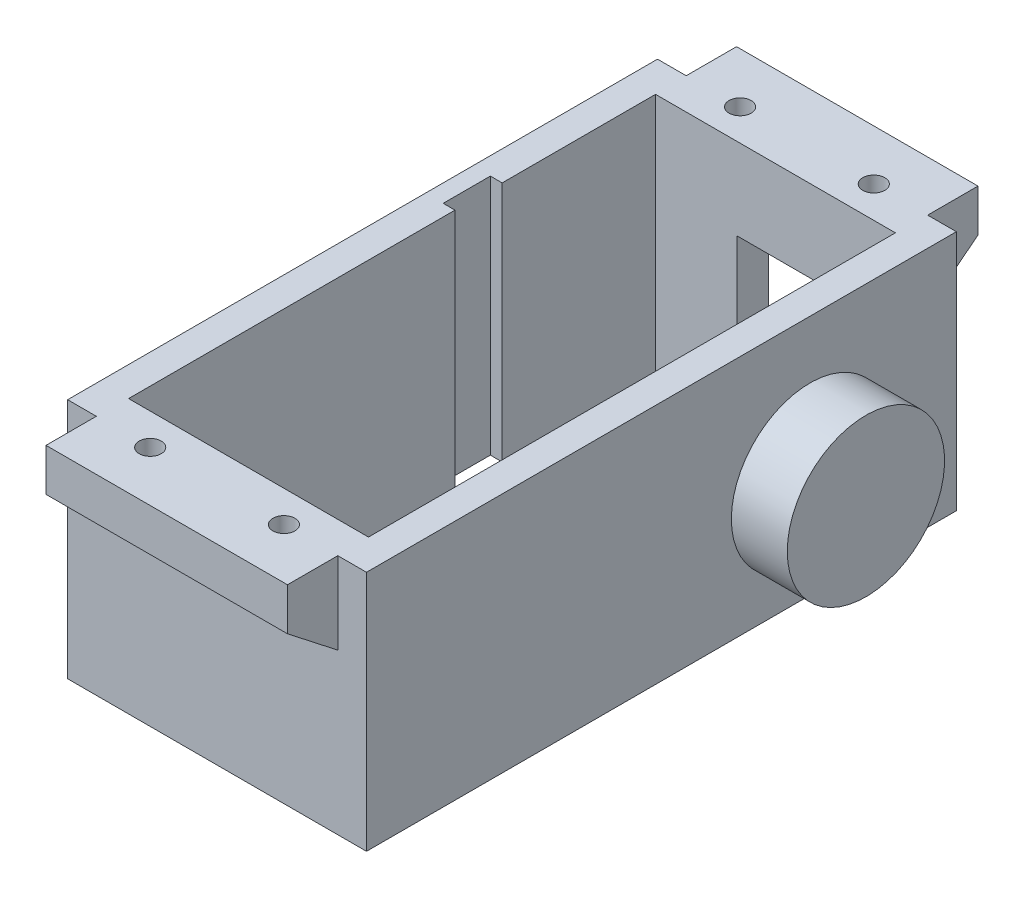
ISO-10303-21;
HEADER;
FILE_DESCRIPTION(('STEP AP214'),'2;1');
FILE_NAME('part.step','',(''),(''),'','','');
FILE_SCHEMA(('AUTOMOTIVE_DESIGN { 1 0 10303 214 1 1 1 1 }'));
ENDSEC;
DATA;
#1=APPLICATION_CONTEXT('core data for automotive mechanical design processes');
#2=APPLICATION_PROTOCOL_DEFINITION('international standard','automotive_design',2000,#1);
#3=PRODUCT_CONTEXT('',#1,'mechanical');
#4=PRODUCT('Part','Part','',(#3));
#5=PRODUCT_RELATED_PRODUCT_CATEGORY('part','',(#4));
#6=PRODUCT_DEFINITION_FORMATION('','',#4);
#7=PRODUCT_DEFINITION_CONTEXT('part definition',#1,'design');
#8=PRODUCT_DEFINITION('design','',#6,#7);
#9=PRODUCT_DEFINITION_SHAPE('','',#8);
#10=(LENGTH_UNIT() NAMED_UNIT(*) SI_UNIT(.MILLI.,.METRE.));
#11=(NAMED_UNIT(*) PLANE_ANGLE_UNIT() SI_UNIT($,.RADIAN.));
#12=(NAMED_UNIT(*) SI_UNIT($,.STERADIAN.) SOLID_ANGLE_UNIT());
#13=UNCERTAINTY_MEASURE_WITH_UNIT(LENGTH_MEASURE(1.E-05),#10,'distance_accuracy_value','');
#14=(GEOMETRIC_REPRESENTATION_CONTEXT(3) GLOBAL_UNCERTAINTY_ASSIGNED_CONTEXT((#13)) GLOBAL_UNIT_ASSIGNED_CONTEXT((#10,
#11,#12)) REPRESENTATION_CONTEXT('',''));
#15=CARTESIAN_POINT('',(0.,0.,0.));
#16=DIRECTION('',(0.,0.,1.));
#17=DIRECTION('',(1.,0.,0.));
#18=AXIS2_PLACEMENT_3D('',#15,#16,#17);
#19=CARTESIAN_POINT('',(-15.25,0.,33.5));
#20=DIRECTION('',(-1.,0.,0.));
#21=DIRECTION('',(0.,0.,1.));
#22=AXIS2_PLACEMENT_3D('',#19,#20,#21);
#23=PLANE('',#22);
#24=DIRECTION('',(0.,0.,1.));
#25=VECTOR('',#24,1.);
#26=CARTESIAN_POINT('',(-15.25,0.,33.5));
#27=LINE('',#26,#25);
#28=CARTESIAN_POINT('',(-15.25,0.,-8.00000000000001));
#29=VERTEX_POINT('',#28);
#30=CARTESIAN_POINT('',(-15.25,0.,33.5));
#31=VERTEX_POINT('',#30);
#32=EDGE_CURVE('E331',#29,#31,#27,.T.);
#33=ORIENTED_EDGE('',*,*,#32,.F.);
#34=DIRECTION('',(0.,-1.,0.));
#35=VECTOR('',#34,1.);
#36=CARTESIAN_POINT('',(-15.25,0.,-8.00000000000001));
#37=LINE('',#36,#35);
#38=CARTESIAN_POINT('',(-15.25,30.73,-8.00000000000001));
#39=VERTEX_POINT('',#38);
#40=EDGE_CURVE('E209',#39,#29,#37,.T.);
#41=ORIENTED_EDGE('',*,*,#40,.F.);
#42=DIRECTION('',(0.,0.,1.));
#43=VECTOR('',#42,1.);
#44=CARTESIAN_POINT('',(-15.25,30.73,33.5));
#45=LINE('',#44,#43);
#46=CARTESIAN_POINT('',(-15.25,30.73,33.5));
#47=VERTEX_POINT('',#46);
#48=EDGE_CURVE('E325',#39,#47,#45,.T.);
#49=ORIENTED_EDGE('',*,*,#48,.T.);
#50=DIRECTION('',(0.,1.,0.));
#51=VECTOR('',#50,1.);
#52=CARTESIAN_POINT('',(-15.25,0.,33.5));
#53=LINE('',#52,#51);
#54=EDGE_CURVE('E341',#31,#47,#53,.T.);
#55=ORIENTED_EDGE('',*,*,#54,.F.);
#56=EDGE_LOOP('',(#33,#41,#49,#55));
#57=FACE_BOUND('',#56,.T.);
#58=ADVANCED_FACE('F43',(#57),#23,.F.);
#59=CARTESIAN_POINT('',(15.35,20.33,43.9));
#60=DIRECTION('',(1.,0.,0.));
#61=DIRECTION('',(0.,0.,-1.));
#62=AXIS2_PLACEMENT_3D('',#59,#60,#61);
#63=PLANE('',#62);
#64=DIRECTION('',(0.,-1.,0.));
#65=VECTOR('',#64,1.);
#66=CARTESIAN_POINT('',(15.35,20.33,43.9));
#67=LINE('',#66,#65);
#68=CARTESIAN_POINT('',(15.35,30.73,43.9));
#69=VERTEX_POINT('',#68);
#70=CARTESIAN_POINT('',(15.35,25.330228009643,43.9));
#71=VERTEX_POINT('',#70);
#72=EDGE_CURVE('E269',#69,#71,#67,.T.);
#73=ORIENTED_EDGE('',*,*,#72,.T.);
#74=DIRECTION('',(0.,-0.615661475325662,-0.788010753606719));
#75=VECTOR('',#74,1.);
#76=CARTESIAN_POINT('',(15.35,20.33,37.5));
#77=LINE('',#76,#75);
#78=CARTESIAN_POINT('',(15.35,20.33,37.5));
#79=VERTEX_POINT('',#78);
#80=EDGE_CURVE('E66',#71,#79,#77,.T.);
#81=ORIENTED_EDGE('',*,*,#80,.T.);
#82=DIRECTION('',(0.,-1.,0.));
#83=VECTOR('',#82,1.);
#84=CARTESIAN_POINT('',(15.35,20.33,37.5));
#85=LINE('',#84,#83);
#86=CARTESIAN_POINT('',(15.35,30.73,37.5));
#87=VERTEX_POINT('',#86);
#88=EDGE_CURVE('E268',#87,#79,#85,.T.);
#89=ORIENTED_EDGE('',*,*,#88,.F.);
#90=DIRECTION('',(0.,0.,-1.));
#91=VECTOR('',#90,1.);
#92=CARTESIAN_POINT('',(15.35,30.73,43.9));
#93=LINE('',#92,#91);
#94=EDGE_CURVE('E287',#69,#87,#93,.T.);
#95=ORIENTED_EDGE('',*,*,#94,.F.);
#96=EDGE_LOOP('',(#73,#81,#89,#95));
#97=FACE_BOUND('',#96,.T.);
#98=ADVANCED_FACE('F472',(#97),#63,.T.);
#99=CARTESIAN_POINT('',(-15.35,20.33,43.9));
#100=DIRECTION('',(-1.,0.,0.));
#101=DIRECTION('',(0.,0.,1.));
#102=AXIS2_PLACEMENT_3D('',#99,#100,#101);
#103=PLANE('',#102);
#104=DIRECTION('',(0.,1.,0.));
#105=VECTOR('',#104,1.);
#106=CARTESIAN_POINT('',(-15.35,20.33,37.5));
#107=LINE('',#106,#105);
#108=CARTESIAN_POINT('',(-15.35,20.33,37.5));
#109=VERTEX_POINT('',#108);
#110=CARTESIAN_POINT('',(-15.35,30.73,37.5));
#111=VERTEX_POINT('',#110);
#112=EDGE_CURVE('E281',#109,#111,#107,.T.);
#113=ORIENTED_EDGE('',*,*,#112,.F.);
#114=DIRECTION('',(0.,-0.615661475325662,-0.788010753606719));
#115=VECTOR('',#114,1.);
#116=CARTESIAN_POINT('',(-15.35,20.33,37.5));
#117=LINE('',#116,#115);
#118=CARTESIAN_POINT('',(-15.35,25.330228009643,43.9));
#119=VERTEX_POINT('',#118);
#120=EDGE_CURVE('E266',#119,#109,#117,.T.);
#121=ORIENTED_EDGE('',*,*,#120,.F.);
#122=DIRECTION('',(0.,1.,0.));
#123=VECTOR('',#122,1.);
#124=CARTESIAN_POINT('',(-15.35,20.33,43.9));
#125=LINE('',#124,#123);
#126=CARTESIAN_POINT('',(-15.35,30.73,43.9));
#127=VERTEX_POINT('',#126);
#128=EDGE_CURVE('E276',#119,#127,#125,.T.);
#129=ORIENTED_EDGE('',*,*,#128,.T.);
#130=DIRECTION('',(0.,0.,-1.));
#131=VECTOR('',#130,1.);
#132=CARTESIAN_POINT('',(-15.35,30.73,43.9));
#133=LINE('',#132,#131);
#134=EDGE_CURVE('E278',#127,#111,#133,.T.);
#135=ORIENTED_EDGE('',*,*,#134,.T.);
#136=EDGE_LOOP('',(#113,#121,#129,#135));
#137=FACE_BOUND('',#136,.T.);
#138=ADVANCED_FACE('F476',(#137),#103,.T.);
#139=CARTESIAN_POINT('',(0.,0.,43.9));
#140=DIRECTION('',(0.,0.,1.));
#141=DIRECTION('',(-1.,0.,0.));
#142=AXIS2_PLACEMENT_3D('',#139,#140,#141);
#143=PLANE('',#142);
#144=ORIENTED_EDGE('',*,*,#128,.F.);
#145=DIRECTION('',(1.,0.,0.));
#146=VECTOR('',#145,1.);
#147=CARTESIAN_POINT('',(-26.111,25.330228009643,43.9));
#148=LINE('',#147,#146);
#149=EDGE_CURVE('E264',#119,#71,#148,.T.);
#150=ORIENTED_EDGE('',*,*,#149,.T.);
#151=ORIENTED_EDGE('',*,*,#72,.F.);
#152=DIRECTION('',(1.,0.,0.));
#153=VECTOR('',#152,1.);
#154=CARTESIAN_POINT('',(-15.35,30.73,43.9));
#155=LINE('',#154,#153);
#156=EDGE_CURVE('E272',#127,#69,#155,.T.);
#157=ORIENTED_EDGE('',*,*,#156,.F.);
#158=EDGE_LOOP('',(#144,#150,#151,#157));
#159=FACE_BOUND('',#158,.T.);
#160=ADVANCED_FACE('F470',(#159),#143,.T.);
#161=CARTESIAN_POINT('',(19.,30.73,-37.5));
#162=DIRECTION('',(0.,0.,1.));
#163=DIRECTION('',(1.,0.,0.));
#164=AXIS2_PLACEMENT_3D('',#161,#162,#163);
#165=PLANE('',#164);
#166=DIRECTION('',(-1.,0.,0.));
#167=VECTOR('',#166,1.);
#168=CARTESIAN_POINT('',(19.,0.,-37.5));
#169=LINE('',#168,#167);
#170=CARTESIAN_POINT('',(19.,0.,-37.5));
#171=VERTEX_POINT('',#170);
#172=CARTESIAN_POINT('',(4.9,0.,-37.5));
#173=VERTEX_POINT('',#172);
#174=EDGE_CURVE('E392',#171,#173,#169,.T.);
#175=ORIENTED_EDGE('',*,*,#174,.T.);
#176=DIRECTION('',(0.,-1.,0.));
#177=VECTOR('',#176,1.);
#178=CARTESIAN_POINT('',(4.9,0.,-37.5));
#179=LINE('',#178,#177);
#180=CARTESIAN_POINT('',(4.9,20.33,-37.5));
#181=VERTEX_POINT('',#180);
#182=EDGE_CURVE('E305',#181,#173,#179,.T.);
#183=ORIENTED_EDGE('',*,*,#182,.F.);
#184=DIRECTION('',(-1.,0.,0.));
#185=VECTOR('',#184,1.);
#186=CARTESIAN_POINT('',(-15.35,20.33,-37.5));
#187=LINE('',#186,#185);
#188=CARTESIAN_POINT('',(15.35,20.33,-37.5));
#189=VERTEX_POINT('',#188);
#190=EDGE_CURVE('E375',#189,#181,#187,.T.);
#191=ORIENTED_EDGE('',*,*,#190,.F.);
#192=DIRECTION('',(0.,-1.,0.));
#193=VECTOR('',#192,1.);
#194=CARTESIAN_POINT('',(15.35,20.33,-37.5));
#195=LINE('',#194,#193);
#196=CARTESIAN_POINT('',(15.35,30.73,-37.5));
#197=VERTEX_POINT('',#196);
#198=EDGE_CURVE('E356',#197,#189,#195,.T.);
#199=ORIENTED_EDGE('',*,*,#198,.F.);
#200=DIRECTION('',(-1.,0.,0.));
#201=VECTOR('',#200,1.);
#202=CARTESIAN_POINT('',(19.,30.73,-37.5));
#203=LINE('',#202,#201);
#204=CARTESIAN_POINT('',(19.,30.73,-37.5));
#205=VERTEX_POINT('',#204);
#206=EDGE_CURVE('E399',#205,#197,#203,.T.);
#207=ORIENTED_EDGE('',*,*,#206,.F.);
#208=DIRECTION('',(0.,-1.,0.));
#209=VECTOR('',#208,1.);
#210=CARTESIAN_POINT('',(19.,30.73,-37.5));
#211=LINE('',#210,#209);
#212=EDGE_CURVE('E414',#205,#171,#211,.T.);
#213=ORIENTED_EDGE('',*,*,#212,.T.);
#214=EDGE_LOOP('',(#175,#183,#191,#199,#207,#213));
#215=FACE_BOUND('',#214,.T.);
#216=ADVANCED_FACE('F439',(#215),#165,.F.);
#217=CARTESIAN_POINT('',(-4.9,20.33,-37.5));
#218=VERTEX_POINT('',#217);
#219=CARTESIAN_POINT('',(-15.35,20.33,-37.5));
#220=VERTEX_POINT('',#219);
#221=EDGE_CURVE('E374',#218,#220,#187,.T.);
#222=ORIENTED_EDGE('',*,*,#221,.F.);
#223=DIRECTION('',(0.,1.,0.));
#224=VECTOR('',#223,1.);
#225=CARTESIAN_POINT('',(-4.9,0.,-37.5));
#226=LINE('',#225,#224);
#227=CARTESIAN_POINT('',(-4.9,0.,-37.5));
#228=VERTEX_POINT('',#227);
#229=EDGE_CURVE('E307',#228,#218,#226,.T.);
#230=ORIENTED_EDGE('',*,*,#229,.F.);
#231=CARTESIAN_POINT('',(-19.,0.,-37.5));
#232=VERTEX_POINT('',#231);
#233=EDGE_CURVE('E409',#228,#232,#169,.T.);
#234=ORIENTED_EDGE('',*,*,#233,.T.);
#235=DIRECTION('',(0.,-1.,0.));
#236=VECTOR('',#235,1.);
#237=CARTESIAN_POINT('',(-19.,30.73,-37.5));
#238=LINE('',#237,#236);
#239=CARTESIAN_POINT('',(-19.,30.73,-37.5));
#240=VERTEX_POINT('',#239);
#241=EDGE_CURVE('E402',#240,#232,#238,.T.);
#242=ORIENTED_EDGE('',*,*,#241,.F.);
#243=CARTESIAN_POINT('',(-15.35,30.73,-37.5));
#244=VERTEX_POINT('',#243);
#245=EDGE_CURVE('E398',#244,#240,#203,.T.);
#246=ORIENTED_EDGE('',*,*,#245,.F.);
#247=DIRECTION('',(0.,1.,0.));
#248=VECTOR('',#247,1.);
#249=CARTESIAN_POINT('',(-15.35,20.33,-37.5));
#250=LINE('',#249,#248);
#251=EDGE_CURVE('E367',#220,#244,#250,.T.);
#252=ORIENTED_EDGE('',*,*,#251,.F.);
#253=EDGE_LOOP('',(#222,#230,#234,#242,#246,#252));
#254=FACE_BOUND('',#253,.T.);
#255=ADVANCED_FACE('F461',(#254),#165,.F.);
#256=CARTESIAN_POINT('',(-19.,30.73,37.5));
#257=DIRECTION('',(1.,0.,0.));
#258=DIRECTION('',(0.,0.,-1.));
#259=AXIS2_PLACEMENT_3D('',#256,#257,#258);
#260=PLANE('',#259);
#261=CARTESIAN_POINT('',(-19.,13.38,-18.89));
#262=DIRECTION('',(1.,0.,0.));
#263=DIRECTION('',(0.,0.,-1.));
#264=AXIS2_PLACEMENT_3D('',#261,#262,#263);
#265=CIRCLE('',#264,10.);
#266=CARTESIAN_POINT('',(-19.,13.38,-28.89));
#267=VERTEX_POINT('',#266);
#268=EDGE_CURVE('E11',#267,#267,#265,.F.);
#269=ORIENTED_EDGE('',*,*,#268,.F.);
#270=EDGE_LOOP('',(#269));
#271=FACE_BOUND('',#270,.T.);
#272=DIRECTION('',(0.,0.,1.));
#273=VECTOR('',#272,1.);
#274=CARTESIAN_POINT('',(-19.,0.,37.5));
#275=LINE('',#274,#273);
#276=CARTESIAN_POINT('',(-19.,0.,37.5));
#277=VERTEX_POINT('',#276);
#278=EDGE_CURVE('E387',#232,#277,#275,.T.);
#279=ORIENTED_EDGE('',*,*,#278,.T.);
#280=DIRECTION('',(0.,-1.,0.));
#281=VECTOR('',#280,1.);
#282=CARTESIAN_POINT('',(-19.,30.73,37.5));
#283=LINE('',#282,#281);
#284=CARTESIAN_POINT('',(-19.,30.73,37.5));
#285=VERTEX_POINT('',#284);
#286=EDGE_CURVE('E51',#285,#277,#283,.T.);
#287=ORIENTED_EDGE('',*,*,#286,.F.);
#288=DIRECTION('',(0.,0.,1.));
#289=VECTOR('',#288,1.);
#290=CARTESIAN_POINT('',(-19.,30.73,37.5));
#291=LINE('',#290,#289);
#292=EDGE_CURVE('E388',#240,#285,#291,.T.);
#293=ORIENTED_EDGE('',*,*,#292,.F.);
#294=ORIENTED_EDGE('',*,*,#241,.T.);
#295=EDGE_LOOP('',(#279,#287,#293,#294));
#296=FACE_BOUND('',#295,.T.);
#297=ADVANCED_FACE('F45',(#271,#296),#260,.F.);
#298=CARTESIAN_POINT('',(19.,30.73,37.5));
#299=DIRECTION('',(0.,0.,-1.));
#300=DIRECTION('',(-1.,0.,0.));
#301=AXIS2_PLACEMENT_3D('',#298,#299,#300);
#302=PLANE('',#301);
#303=DIRECTION('',(1.,0.,0.));
#304=VECTOR('',#303,1.);
#305=CARTESIAN_POINT('',(19.,30.73,37.5));
#306=LINE('',#305,#304);
#307=CARTESIAN_POINT('',(19.,30.73,37.5));
#308=VERTEX_POINT('',#307);
#309=EDGE_CURVE('E391',#87,#308,#306,.T.);
#310=ORIENTED_EDGE('',*,*,#309,.F.);
#311=ORIENTED_EDGE('',*,*,#88,.T.);
#312=DIRECTION('',(-1.,0.,0.));
#313=VECTOR('',#312,1.);
#314=CARTESIAN_POINT('',(-15.35,20.33,37.5));
#315=LINE('',#314,#313);
#316=EDGE_CURVE('E273',#79,#109,#315,.T.);
#317=ORIENTED_EDGE('',*,*,#316,.T.);
#318=ORIENTED_EDGE('',*,*,#112,.T.);
#319=EDGE_CURVE('E393',#285,#111,#306,.T.);
#320=ORIENTED_EDGE('',*,*,#319,.F.);
#321=ORIENTED_EDGE('',*,*,#286,.T.);
#322=DIRECTION('',(1.,0.,0.));
#323=VECTOR('',#322,1.);
#324=CARTESIAN_POINT('',(19.,0.,37.5));
#325=LINE('',#324,#323);
#326=CARTESIAN_POINT('',(19.,0.,37.5));
#327=VERTEX_POINT('',#326);
#328=EDGE_CURVE('E405',#277,#327,#325,.T.);
#329=ORIENTED_EDGE('',*,*,#328,.T.);
#330=DIRECTION('',(0.,-1.,0.));
#331=VECTOR('',#330,1.);
#332=CARTESIAN_POINT('',(19.,30.73,37.5));
#333=LINE('',#332,#331);
#334=EDGE_CURVE('E417',#308,#327,#333,.T.);
#335=ORIENTED_EDGE('',*,*,#334,.F.);
#336=EDGE_LOOP('',(#310,#311,#317,#318,#320,#321,#329,#335));
#337=FACE_BOUND('',#336,.T.);
#338=ADVANCED_FACE('F423',(#337),#302,.F.);
#339=CARTESIAN_POINT('',(19.,30.73,37.5));
#340=DIRECTION('',(-1.,0.,0.));
#341=DIRECTION('',(0.,0.,1.));
#342=AXIS2_PLACEMENT_3D('',#339,#340,#341);
#343=PLANE('',#342);
#344=CARTESIAN_POINT('',(19.,13.38,-18.89));
#345=DIRECTION('',(-1.,0.,0.));
#346=DIRECTION('',(0.,0.,1.));
#347=AXIS2_PLACEMENT_3D('',#344,#345,#346);
#348=CIRCLE('',#347,10.);
#349=CARTESIAN_POINT('',(19.,13.38,-8.89));
#350=VERTEX_POINT('',#349);
#351=EDGE_CURVE('E314',#350,#350,#348,.T.);
#352=ORIENTED_EDGE('',*,*,#351,.T.);
#353=EDGE_LOOP('',(#352));
#354=FACE_BOUND('',#353,.T.);
#355=DIRECTION('',(0.,0.,-1.));
#356=VECTOR('',#355,1.);
#357=CARTESIAN_POINT('',(19.,0.,37.5));
#358=LINE('',#357,#356);
#359=EDGE_CURVE('E407',#327,#171,#358,.T.);
#360=ORIENTED_EDGE('',*,*,#359,.T.);
#361=ORIENTED_EDGE('',*,*,#212,.F.);
#362=DIRECTION('',(0.,0.,-1.));
#363=VECTOR('',#362,1.);
#364=CARTESIAN_POINT('',(19.,30.73,37.5));
#365=LINE('',#364,#363);
#366=EDGE_CURVE('E396',#308,#205,#365,.T.);
#367=ORIENTED_EDGE('',*,*,#366,.F.);
#368=ORIENTED_EDGE('',*,*,#334,.T.);
#369=EDGE_LOOP('',(#360,#361,#367,#368));
#370=FACE_BOUND('',#369,.T.);
#371=ADVANCED_FACE('F435',(#354,#370),#343,.F.);
#372=CARTESIAN_POINT('',(0.,30.73,0.));
#373=DIRECTION('',(0.,1.,0.));
#374=DIRECTION('',(0.,0.,1.));
#375=AXIS2_PLACEMENT_3D('',#372,#373,#374);
#376=PLANE('',#375);
#377=DIRECTION('',(1.,0.,0.));
#378=VECTOR('',#377,1.);
#379=CARTESIAN_POINT('',(-16.75,30.73,-8.00000000000001));
#380=LINE('',#379,#378);
#381=CARTESIAN_POINT('',(-16.75,30.73,-8.00000000000001));
#382=VERTEX_POINT('',#381);
#383=EDGE_CURVE('E233',#382,#39,#380,.T.);
#384=ORIENTED_EDGE('',*,*,#383,.F.);
#385=DIRECTION('',(0.,0.,1.));
#386=VECTOR('',#385,1.);
#387=CARTESIAN_POINT('',(-16.75,30.73,-14.));
#388=LINE('',#387,#386);
#389=CARTESIAN_POINT('',(-16.75,30.73,-14.));
#390=VERTEX_POINT('',#389);
#391=EDGE_CURVE('E213',#390,#382,#388,.T.);
#392=ORIENTED_EDGE('',*,*,#391,.F.);
#393=DIRECTION('',(1.,0.,0.));
#394=VECTOR('',#393,1.);
#395=CARTESIAN_POINT('',(-16.75,30.73,-14.));
#396=LINE('',#395,#394);
#397=CARTESIAN_POINT('',(-15.25,30.73,-14.));
#398=VERTEX_POINT('',#397);
#399=EDGE_CURVE('E236',#390,#398,#396,.T.);
#400=ORIENTED_EDGE('',*,*,#399,.T.);
#401=CARTESIAN_POINT('',(-15.25,30.73,-33.5));
#402=VERTEX_POINT('',#401);
#403=EDGE_CURVE('E342',#402,#398,#45,.T.);
#404=ORIENTED_EDGE('',*,*,#403,.F.);
#405=DIRECTION('',(-1.,0.,0.));
#406=VECTOR('',#405,1.);
#407=CARTESIAN_POINT('',(15.25,30.73,-33.5));
#408=LINE('',#407,#406);
#409=CARTESIAN_POINT('',(15.25,30.73,-33.5));
#410=VERTEX_POINT('',#409);
#411=EDGE_CURVE('E351',#410,#402,#408,.T.);
#412=ORIENTED_EDGE('',*,*,#411,.F.);
#413=DIRECTION('',(0.,0.,-1.));
#414=VECTOR('',#413,1.);
#415=CARTESIAN_POINT('',(15.25,30.73,33.5));
#416=LINE('',#415,#414);
#417=CARTESIAN_POINT('',(15.25,30.73,33.5));
#418=VERTEX_POINT('',#417);
#419=EDGE_CURVE('E348',#418,#410,#416,.T.);
#420=ORIENTED_EDGE('',*,*,#419,.F.);
#421=DIRECTION('',(1.,0.,0.));
#422=VECTOR('',#421,1.);
#423=CARTESIAN_POINT('',(15.25,30.73,33.5));
#424=LINE('',#423,#422);
#425=EDGE_CURVE('E345',#47,#418,#424,.T.);
#426=ORIENTED_EDGE('',*,*,#425,.F.);
#427=ORIENTED_EDGE('',*,*,#48,.F.);
#428=EDGE_LOOP('',(#384,#392,#400,#404,#412,#420,#426,#427));
#429=FACE_BOUND('',#428,.T.);
#430=CARTESIAN_POINT('',(-8.49999999999999,30.73,37.5));
#431=DIRECTION('',(0.,1.,0.));
#432=DIRECTION('',(0.,0.,-1.));
#433=AXIS2_PLACEMENT_3D('',#430,#431,#432);
#434=CIRCLE('',#433,1.4);
#435=CARTESIAN_POINT('',(-8.49999999999999,30.73,36.1));
#436=VERTEX_POINT('',#435);
#437=EDGE_CURVE('E253',#436,#436,#434,.T.);
#438=ORIENTED_EDGE('',*,*,#437,.F.);
#439=EDGE_LOOP('',(#438));
#440=FACE_BOUND('',#439,.T.);
#441=CARTESIAN_POINT('',(8.5,30.73,37.5));
#442=DIRECTION('',(0.,1.,0.));
#443=DIRECTION('',(0.,0.,1.));
#444=AXIS2_PLACEMENT_3D('',#441,#442,#443);
#445=CIRCLE('',#444,1.4);
#446=CARTESIAN_POINT('',(8.5,30.73,38.9));
#447=VERTEX_POINT('',#446);
#448=EDGE_CURVE('E247',#447,#447,#445,.T.);
#449=ORIENTED_EDGE('',*,*,#448,.F.);
#450=EDGE_LOOP('',(#449));
#451=FACE_BOUND('',#450,.T.);
#452=CARTESIAN_POINT('',(8.5,30.73,-37.5));
#453=DIRECTION('',(0.,1.,0.));
#454=DIRECTION('',(0.,0.,-1.));
#455=AXIS2_PLACEMENT_3D('',#452,#453,#454);
#456=CIRCLE('',#455,1.4);
#457=CARTESIAN_POINT('',(8.5,30.73,-38.9));
#458=VERTEX_POINT('',#457);
#459=EDGE_CURVE('E240',#458,#458,#456,.T.);
#460=ORIENTED_EDGE('',*,*,#459,.F.);
#461=EDGE_LOOP('',(#460));
#462=FACE_BOUND('',#461,.T.);
#463=CARTESIAN_POINT('',(-8.5,30.73,-37.5));
#464=DIRECTION('',(0.,1.,0.));
#465=DIRECTION('',(0.,0.,1.));
#466=AXIS2_PLACEMENT_3D('',#463,#464,#465);
#467=CIRCLE('',#466,1.4);
#468=CARTESIAN_POINT('',(-8.5,30.73,-36.1));
#469=VERTEX_POINT('',#468);
#470=EDGE_CURVE('E243',#469,#469,#467,.T.);
#471=ORIENTED_EDGE('',*,*,#470,.F.);
#472=EDGE_LOOP('',(#471));
#473=FACE_BOUND('',#472,.T.);
#474=ORIENTED_EDGE('',*,*,#292,.T.);
#475=ORIENTED_EDGE('',*,*,#319,.T.);
#476=ORIENTED_EDGE('',*,*,#134,.F.);
#477=ORIENTED_EDGE('',*,*,#156,.T.);
#478=ORIENTED_EDGE('',*,*,#94,.T.);
#479=ORIENTED_EDGE('',*,*,#309,.T.);
#480=ORIENTED_EDGE('',*,*,#366,.T.);
#481=ORIENTED_EDGE('',*,*,#206,.T.);
#482=DIRECTION('',(0.,0.,1.));
#483=VECTOR('',#482,1.);
#484=CARTESIAN_POINT('',(15.35,30.73,-43.9));
#485=LINE('',#484,#483);
#486=CARTESIAN_POINT('',(15.35,30.73,-43.9));
#487=VERTEX_POINT('',#486);
#488=EDGE_CURVE('E371',#487,#197,#485,.T.);
#489=ORIENTED_EDGE('',*,*,#488,.F.);
#490=DIRECTION('',(1.,0.,0.));
#491=VECTOR('',#490,1.);
#492=CARTESIAN_POINT('',(-15.35,30.73,-43.9));
#493=LINE('',#492,#491);
#494=CARTESIAN_POINT('',(-15.35,30.73,-43.9));
#495=VERTEX_POINT('',#494);
#496=EDGE_CURVE('E369',#495,#487,#493,.T.);
#497=ORIENTED_EDGE('',*,*,#496,.F.);
#498=DIRECTION('',(0.,0.,1.));
#499=VECTOR('',#498,1.);
#500=CARTESIAN_POINT('',(-15.35,30.73,-43.9));
#501=LINE('',#500,#499);
#502=EDGE_CURVE('E381',#495,#244,#501,.T.);
#503=ORIENTED_EDGE('',*,*,#502,.T.);
#504=ORIENTED_EDGE('',*,*,#245,.T.);
#505=EDGE_LOOP('',(#474,#475,#476,#477,#478,#479,#480,#481,#489,#497,#503,#504));
#506=FACE_BOUND('',#505,.T.);
#507=ADVANCED_FACE('F444',(#429,#440,#451,#462,#473,#506),#376,.T.);
#508=CARTESIAN_POINT('',(0.,0.,0.));
#509=DIRECTION('',(0.,1.,0.));
#510=DIRECTION('',(0.,0.,1.));
#511=AXIS2_PLACEMENT_3D('',#508,#509,#510);
#512=PLANE('',#511);
#513=DIRECTION('',(0.,0.,-1.));
#514=VECTOR('',#513,1.);
#515=CARTESIAN_POINT('',(-16.75,0.,-14.));
#516=LINE('',#515,#514);
#517=CARTESIAN_POINT('',(-16.75,0.,-8.00000000000001));
#518=VERTEX_POINT('',#517);
#519=CARTESIAN_POINT('',(-16.75,0.,-14.));
#520=VERTEX_POINT('',#519);
#521=EDGE_CURVE('E219',#518,#520,#516,.T.);
#522=ORIENTED_EDGE('',*,*,#521,.F.);
#523=DIRECTION('',(1.,0.,0.));
#524=VECTOR('',#523,1.);
#525=CARTESIAN_POINT('',(-16.75,0.,-8.00000000000001));
#526=LINE('',#525,#524);
#527=EDGE_CURVE('E203',#518,#29,#526,.T.);
#528=ORIENTED_EDGE('',*,*,#527,.T.);
#529=ORIENTED_EDGE('',*,*,#32,.T.);
#530=DIRECTION('',(1.,0.,0.));
#531=VECTOR('',#530,1.);
#532=CARTESIAN_POINT('',(15.25,0.,33.5));
#533=LINE('',#532,#531);
#534=CARTESIAN_POINT('',(15.25,0.,33.5));
#535=VERTEX_POINT('',#534);
#536=EDGE_CURVE('E330',#31,#535,#533,.T.);
#537=ORIENTED_EDGE('',*,*,#536,.T.);
#538=DIRECTION('',(0.,0.,-1.));
#539=VECTOR('',#538,1.);
#540=CARTESIAN_POINT('',(15.25,0.,33.5));
#541=LINE('',#540,#539);
#542=CARTESIAN_POINT('',(15.25,0.,-33.5));
#543=VERTEX_POINT('',#542);
#544=EDGE_CURVE('E334',#535,#543,#541,.T.);
#545=ORIENTED_EDGE('',*,*,#544,.T.);
#546=DIRECTION('',(-1.,0.,0.));
#547=VECTOR('',#546,1.);
#548=CARTESIAN_POINT('',(15.25,0.,-33.5));
#549=LINE('',#548,#547);
#550=CARTESIAN_POINT('',(4.9,0.,-33.5));
#551=VERTEX_POINT('',#550);
#552=EDGE_CURVE('E338',#543,#551,#549,.T.);
#553=ORIENTED_EDGE('',*,*,#552,.T.);
#554=DIRECTION('',(0.,0.,-1.));
#555=VECTOR('',#554,1.);
#556=CARTESIAN_POINT('',(4.9,0.,37.501));
#557=LINE('',#556,#555);
#558=EDGE_CURVE('E310',#551,#173,#557,.T.);
#559=ORIENTED_EDGE('',*,*,#558,.T.);
#560=ORIENTED_EDGE('',*,*,#174,.F.);
#561=ORIENTED_EDGE('',*,*,#359,.F.);
#562=ORIENTED_EDGE('',*,*,#328,.F.);
#563=ORIENTED_EDGE('',*,*,#278,.F.);
#564=ORIENTED_EDGE('',*,*,#233,.F.);
#565=DIRECTION('',(0.,0.,-1.));
#566=VECTOR('',#565,1.);
#567=CARTESIAN_POINT('',(-4.9,0.,37.501));
#568=LINE('',#567,#566);
#569=CARTESIAN_POINT('',(-4.9,0.,-33.5));
#570=VERTEX_POINT('',#569);
#571=EDGE_CURVE('E318',#570,#228,#568,.T.);
#572=ORIENTED_EDGE('',*,*,#571,.F.);
#573=CARTESIAN_POINT('',(-15.25,0.,-33.5));
#574=VERTEX_POINT('',#573);
#575=EDGE_CURVE('E337',#570,#574,#549,.T.);
#576=ORIENTED_EDGE('',*,*,#575,.T.);
#577=CARTESIAN_POINT('',(-15.25,0.,-14.));
#578=VERTEX_POINT('',#577);
#579=EDGE_CURVE('E328',#574,#578,#27,.T.);
#580=ORIENTED_EDGE('',*,*,#579,.T.);
#581=DIRECTION('',(1.,0.,0.));
#582=VECTOR('',#581,1.);
#583=CARTESIAN_POINT('',(-16.75,0.,-14.));
#584=LINE('',#583,#582);
#585=EDGE_CURVE('E58',#520,#578,#584,.T.);
#586=ORIENTED_EDGE('',*,*,#585,.F.);
#587=EDGE_LOOP('',(#522,#528,#529,#537,#545,#553,#559,#560,#561,#562,#563,#564,#572,#576,#580,#586));
#588=FACE_BOUND('',#587,.T.);
#589=ADVANCED_FACE('F224',(#588),#512,.F.);
#590=CARTESIAN_POINT('',(-26.11,13.38,-18.89));
#591=DIRECTION('',(1.,0.,0.));
#592=DIRECTION('',(0.,0.,-1.));
#593=AXIS2_PLACEMENT_3D('',#590,#591,#592);
#594=CYLINDRICAL_SURFACE('',#593,10.);
#595=CARTESIAN_POINT('',(-26.11,13.38,-18.89));
#596=DIRECTION('',(-1.,0.,0.));
#597=DIRECTION('',(0.,0.,1.));
#598=AXIS2_PLACEMENT_3D('',#595,#596,#597);
#599=CIRCLE('',#598,10.);
#600=CARTESIAN_POINT('',(-26.11,13.38,-8.89));
#601=VERTEX_POINT('',#600);
#602=EDGE_CURVE('E384',#601,#601,#599,.T.);
#603=ORIENTED_EDGE('',*,*,#602,.F.);
#604=EDGE_LOOP('',(#603));
#605=FACE_BOUND('',#604,.T.);
#606=ORIENTED_EDGE('',*,*,#268,.T.);
#607=EDGE_LOOP('',(#606));
#608=FACE_BOUND('',#607,.T.);
#609=ADVANCED_FACE('F614',(#605,#608),#594,.T.);
#610=CARTESIAN_POINT('',(-26.11,13.38,-18.89));
#611=DIRECTION('',(-1.,0.,0.));
#612=DIRECTION('',(0.,0.,1.));
#613=AXIS2_PLACEMENT_3D('',#610,#611,#612);
#614=PLANE('',#613);
#615=ORIENTED_EDGE('',*,*,#602,.T.);
#616=EDGE_LOOP('',(#615));
#617=FACE_BOUND('',#616,.T.);
#618=ADVANCED_FACE('F609',(#617),#614,.T.);
#619=CARTESIAN_POINT('',(15.35,20.33,-43.9));
#620=DIRECTION('',(-1.,0.,0.));
#621=DIRECTION('',(0.,0.,1.));
#622=AXIS2_PLACEMENT_3D('',#619,#620,#621);
#623=PLANE('',#622);
#624=ORIENTED_EDGE('',*,*,#198,.T.);
#625=DIRECTION('',(0.,-0.615661475325662,0.788010753606719));
#626=VECTOR('',#625,1.);
#627=CARTESIAN_POINT('',(15.35,20.33,-37.5));
#628=LINE('',#627,#626);
#629=CARTESIAN_POINT('',(15.35,25.330228009643,-43.9));
#630=VERTEX_POINT('',#629);
#631=EDGE_CURVE('E291',#630,#189,#628,.T.);
#632=ORIENTED_EDGE('',*,*,#631,.F.);
#633=DIRECTION('',(0.,-1.,0.));
#634=VECTOR('',#633,1.);
#635=CARTESIAN_POINT('',(15.35,20.33,-43.9));
#636=LINE('',#635,#634);
#637=EDGE_CURVE('E363',#487,#630,#636,.T.);
#638=ORIENTED_EDGE('',*,*,#637,.F.);
#639=ORIENTED_EDGE('',*,*,#488,.T.);
#640=EDGE_LOOP('',(#624,#632,#638,#639));
#641=FACE_BOUND('',#640,.T.);
#642=ADVANCED_FACE('F448',(#641),#623,.F.);
#643=CARTESIAN_POINT('',(-15.35,20.33,-43.9));
#644=DIRECTION('',(0.,1.,0.));
#645=DIRECTION('',(-1.,0.,0.));
#646=AXIS2_PLACEMENT_3D('',#643,#644,#645);
#647=PLANE('',#646);
#648=DIRECTION('',(0.,0.,-1.));
#649=VECTOR('',#648,1.);
#650=CARTESIAN_POINT('',(-4.9,20.33,37.501));
#651=LINE('',#650,#649);
#652=CARTESIAN_POINT('',(-4.9,20.33,-33.5));
#653=VERTEX_POINT('',#652);
#654=EDGE_CURVE('E315',#653,#218,#651,.T.);
#655=ORIENTED_EDGE('',*,*,#654,.T.);
#656=DIRECTION('',(1.,0.,0.));
#657=VECTOR('',#656,1.);
#658=CARTESIAN_POINT('',(-26.111,20.33,-37.5));
#659=LINE('',#658,#657);
#660=EDGE_CURVE('E294',#218,#181,#659,.T.);
#661=ORIENTED_EDGE('',*,*,#660,.T.);
#662=DIRECTION('',(0.,0.,-1.));
#663=VECTOR('',#662,1.);
#664=CARTESIAN_POINT('',(4.9,20.33,37.501));
#665=LINE('',#664,#663);
#666=CARTESIAN_POINT('',(4.9,20.33,-33.5));
#667=VERTEX_POINT('',#666);
#668=EDGE_CURVE('E311',#667,#181,#665,.T.);
#669=ORIENTED_EDGE('',*,*,#668,.F.);
#670=DIRECTION('',(-1.,0.,0.));
#671=VECTOR('',#670,1.);
#672=CARTESIAN_POINT('',(-4.9,20.33,-33.5));
#673=LINE('',#672,#671);
#674=EDGE_CURVE('E300',#667,#653,#673,.T.);
#675=ORIENTED_EDGE('',*,*,#674,.T.);
#676=EDGE_LOOP('',(#655,#661,#669,#675));
#677=FACE_BOUND('',#676,.T.);
#678=ADVANCED_FACE('F599',(#677),#647,.F.);
#679=CARTESIAN_POINT('',(-15.35,20.33,-43.9));
#680=DIRECTION('',(1.,0.,0.));
#681=DIRECTION('',(0.,0.,-1.));
#682=AXIS2_PLACEMENT_3D('',#679,#680,#681);
#683=PLANE('',#682);
#684=DIRECTION('',(0.,1.,0.));
#685=VECTOR('',#684,1.);
#686=CARTESIAN_POINT('',(-15.35,20.33,-43.9));
#687=LINE('',#686,#685);
#688=CARTESIAN_POINT('',(-15.35,25.330228009643,-43.9));
#689=VERTEX_POINT('',#688);
#690=EDGE_CURVE('E366',#689,#495,#687,.T.);
#691=ORIENTED_EDGE('',*,*,#690,.F.);
#692=DIRECTION('',(0.,0.615661475325662,-0.788010753606719));
#693=VECTOR('',#692,1.);
#694=CARTESIAN_POINT('',(-15.35,20.33,-37.5));
#695=LINE('',#694,#693);
#696=EDGE_CURVE('E289',#220,#689,#695,.T.);
#697=ORIENTED_EDGE('',*,*,#696,.F.);
#698=ORIENTED_EDGE('',*,*,#251,.T.);
#699=ORIENTED_EDGE('',*,*,#502,.F.);
#700=EDGE_LOOP('',(#691,#697,#698,#699));
#701=FACE_BOUND('',#700,.T.);
#702=ADVANCED_FACE('F456',(#701),#683,.F.);
#703=CARTESIAN_POINT('',(0.,0.,-43.9));
#704=DIRECTION('',(0.,0.,-1.));
#705=DIRECTION('',(-1.,0.,0.));
#706=AXIS2_PLACEMENT_3D('',#703,#704,#705);
#707=PLANE('',#706);
#708=DIRECTION('',(1.,0.,0.));
#709=VECTOR('',#708,1.);
#710=CARTESIAN_POINT('',(-26.111,25.330228009643,-43.9));
#711=LINE('',#710,#709);
#712=EDGE_CURVE('E293',#689,#630,#711,.T.);
#713=ORIENTED_EDGE('',*,*,#712,.F.);
#714=ORIENTED_EDGE('',*,*,#690,.T.);
#715=ORIENTED_EDGE('',*,*,#496,.T.);
#716=ORIENTED_EDGE('',*,*,#637,.T.);
#717=EDGE_LOOP('',(#713,#714,#715,#716));
#718=FACE_BOUND('',#717,.T.);
#719=ADVANCED_FACE('F452',(#718),#707,.T.);
#720=ORIENTED_EDGE('',*,*,#403,.T.);
#721=DIRECTION('',(0.,1.,0.));
#722=VECTOR('',#721,1.);
#723=CARTESIAN_POINT('',(-15.25,0.,-14.));
#724=LINE('',#723,#722);
#725=EDGE_CURVE('E222',#578,#398,#724,.T.);
#726=ORIENTED_EDGE('',*,*,#725,.F.);
#727=ORIENTED_EDGE('',*,*,#579,.F.);
#728=DIRECTION('',(0.,1.,0.));
#729=VECTOR('',#728,1.);
#730=CARTESIAN_POINT('',(-15.25,0.,-33.5));
#731=LINE('',#730,#729);
#732=EDGE_CURVE('E354',#574,#402,#731,.T.);
#733=ORIENTED_EDGE('',*,*,#732,.T.);
#734=EDGE_LOOP('',(#720,#726,#727,#733));
#735=FACE_BOUND('',#734,.T.);
#736=ADVANCED_FACE('F488',(#735),#23,.F.);
#737=CARTESIAN_POINT('',(15.25,0.,-33.5));
#738=DIRECTION('',(0.,0.,-1.));
#739=DIRECTION('',(-1.,0.,0.));
#740=AXIS2_PLACEMENT_3D('',#737,#738,#739);
#741=PLANE('',#740);
#742=ORIENTED_EDGE('',*,*,#674,.F.);
#743=DIRECTION('',(0.,1.,0.));
#744=VECTOR('',#743,1.);
#745=CARTESIAN_POINT('',(4.9,0.,-33.5));
#746=LINE('',#745,#744);
#747=EDGE_CURVE('E302',#551,#667,#746,.T.);
#748=ORIENTED_EDGE('',*,*,#747,.F.);
#749=ORIENTED_EDGE('',*,*,#552,.F.);
#750=DIRECTION('',(0.,1.,0.));
#751=VECTOR('',#750,1.);
#752=CARTESIAN_POINT('',(15.25,0.,-33.5));
#753=LINE('',#752,#751);
#754=EDGE_CURVE('E357',#543,#410,#753,.T.);
#755=ORIENTED_EDGE('',*,*,#754,.T.);
#756=ORIENTED_EDGE('',*,*,#411,.T.);
#757=ORIENTED_EDGE('',*,*,#732,.F.);
#758=ORIENTED_EDGE('',*,*,#575,.F.);
#759=DIRECTION('',(0.,-1.,0.));
#760=VECTOR('',#759,1.);
#761=CARTESIAN_POINT('',(-4.9,0.,-33.5));
#762=LINE('',#761,#760);
#763=EDGE_CURVE('E297',#653,#570,#762,.T.);
#764=ORIENTED_EDGE('',*,*,#763,.F.);
#765=EDGE_LOOP('',(#742,#748,#749,#755,#756,#757,#758,#764));
#766=FACE_BOUND('',#765,.T.);
#767=ADVANCED_FACE('F496',(#766),#741,.F.);
#768=CARTESIAN_POINT('',(15.25,0.,33.5));
#769=DIRECTION('',(1.,0.,0.));
#770=DIRECTION('',(0.,0.,-1.));
#771=AXIS2_PLACEMENT_3D('',#768,#769,#770);
#772=PLANE('',#771);
#773=ORIENTED_EDGE('',*,*,#419,.T.);
#774=ORIENTED_EDGE('',*,*,#754,.F.);
#775=ORIENTED_EDGE('',*,*,#544,.F.);
#776=DIRECTION('',(0.,1.,0.));
#777=VECTOR('',#776,1.);
#778=CARTESIAN_POINT('',(15.25,0.,33.5));
#779=LINE('',#778,#777);
#780=EDGE_CURVE('E359',#535,#418,#779,.T.);
#781=ORIENTED_EDGE('',*,*,#780,.T.);
#782=EDGE_LOOP('',(#773,#774,#775,#781));
#783=FACE_BOUND('',#782,.T.);
#784=ADVANCED_FACE('F503',(#783),#772,.F.);
#785=CARTESIAN_POINT('',(15.25,0.,33.5));
#786=DIRECTION('',(0.,0.,1.));
#787=DIRECTION('',(1.,0.,0.));
#788=AXIS2_PLACEMENT_3D('',#785,#786,#787);
#789=PLANE('',#788);
#790=ORIENTED_EDGE('',*,*,#425,.T.);
#791=ORIENTED_EDGE('',*,*,#780,.F.);
#792=ORIENTED_EDGE('',*,*,#536,.F.);
#793=ORIENTED_EDGE('',*,*,#54,.T.);
#794=EDGE_LOOP('',(#790,#791,#792,#793));
#795=FACE_BOUND('',#794,.T.);
#796=ADVANCED_FACE('F579',(#795),#789,.F.);
#797=CARTESIAN_POINT('',(26.11,13.38,-18.89));
#798=DIRECTION('',(-1.,0.,0.));
#799=DIRECTION('',(0.,0.,1.));
#800=AXIS2_PLACEMENT_3D('',#797,#798,#799);
#801=CYLINDRICAL_SURFACE('',#800,10.);
#802=CARTESIAN_POINT('',(26.11,13.38,-18.89));
#803=DIRECTION('',(-1.,0.,0.));
#804=DIRECTION('',(0.,0.,1.));
#805=AXIS2_PLACEMENT_3D('',#802,#803,#804);
#806=CIRCLE('',#805,10.);
#807=CARTESIAN_POINT('',(26.11,13.38,-8.89));
#808=VERTEX_POINT('',#807);
#809=EDGE_CURVE('E322',#808,#808,#806,.T.);
#810=ORIENTED_EDGE('',*,*,#809,.T.);
#811=EDGE_LOOP('',(#810));
#812=FACE_BOUND('',#811,.T.);
#813=ORIENTED_EDGE('',*,*,#351,.F.);
#814=EDGE_LOOP('',(#813));
#815=FACE_BOUND('',#814,.T.);
#816=ADVANCED_FACE('F576',(#812,#815),#801,.T.);
#817=CARTESIAN_POINT('',(26.11,13.38,-18.89));
#818=DIRECTION('',(1.,0.,0.));
#819=DIRECTION('',(0.,0.,1.));
#820=AXIS2_PLACEMENT_3D('',#817,#818,#819);
#821=PLANE('',#820);
#822=ORIENTED_EDGE('',*,*,#809,.F.);
#823=EDGE_LOOP('',(#822));
#824=FACE_BOUND('',#823,.T.);
#825=ADVANCED_FACE('F572',(#824),#821,.T.);
#826=CARTESIAN_POINT('',(4.9,0.,37.501));
#827=DIRECTION('',(1.,0.,0.));
#828=DIRECTION('',(0.,1.,0.));
#829=AXIS2_PLACEMENT_3D('',#826,#827,#828);
#830=PLANE('',#829);
#831=ORIENTED_EDGE('',*,*,#747,.T.);
#832=ORIENTED_EDGE('',*,*,#668,.T.);
#833=ORIENTED_EDGE('',*,*,#182,.T.);
#834=ORIENTED_EDGE('',*,*,#558,.F.);
#835=EDGE_LOOP('',(#831,#832,#833,#834));
#836=FACE_BOUND('',#835,.T.);
#837=ADVANCED_FACE('F566',(#836),#830,.F.);
#838=CARTESIAN_POINT('',(-4.9,0.,37.501));
#839=DIRECTION('',(-1.,0.,0.));
#840=DIRECTION('',(0.,-1.,0.));
#841=AXIS2_PLACEMENT_3D('',#838,#839,#840);
#842=PLANE('',#841);
#843=ORIENTED_EDGE('',*,*,#763,.T.);
#844=ORIENTED_EDGE('',*,*,#571,.T.);
#845=ORIENTED_EDGE('',*,*,#229,.T.);
#846=ORIENTED_EDGE('',*,*,#654,.F.);
#847=EDGE_LOOP('',(#843,#844,#845,#846));
#848=FACE_BOUND('',#847,.T.);
#849=ADVANCED_FACE('F560',(#848),#842,.F.);
#850=CARTESIAN_POINT('',(-26.111,20.33,-37.5));
#851=DIRECTION('',(0.,0.788010753606719,0.615661475325662));
#852=DIRECTION('',(0.,-0.615661475325662,0.788010753606719));
#853=AXIS2_PLACEMENT_3D('',#850,#851,#852);
#854=PLANE('',#853);
#855=ORIENTED_EDGE('',*,*,#696,.T.);
#856=ORIENTED_EDGE('',*,*,#712,.T.);
#857=ORIENTED_EDGE('',*,*,#631,.T.);
#858=ORIENTED_EDGE('',*,*,#190,.T.);
#859=ORIENTED_EDGE('',*,*,#660,.F.);
#860=ORIENTED_EDGE('',*,*,#221,.T.);
#861=EDGE_LOOP('',(#855,#856,#857,#858,#859,#860));
#862=FACE_BOUND('',#861,.T.);
#863=ADVANCED_FACE('F555',(#862),#854,.F.);
#864=CARTESIAN_POINT('',(-26.111,20.33,37.5));
#865=DIRECTION('',(0.,-0.788010753606719,0.615661475325662));
#866=DIRECTION('',(0.,-0.615661475325662,-0.788010753606719));
#867=AXIS2_PLACEMENT_3D('',#864,#865,#866);
#868=PLANE('',#867);
#869=ORIENTED_EDGE('',*,*,#120,.T.);
#870=ORIENTED_EDGE('',*,*,#316,.F.);
#871=ORIENTED_EDGE('',*,*,#80,.F.);
#872=ORIENTED_EDGE('',*,*,#149,.F.);
#873=EDGE_LOOP('',(#869,#870,#871,#872));
#874=FACE_BOUND('',#873,.T.);
#875=ADVANCED_FACE('F474',(#874),#868,.T.);
#876=CARTESIAN_POINT('',(-8.5,23.33,-37.5));
#877=DIRECTION('',(0.,1.,0.));
#878=DIRECTION('',(0.,0.,1.));
#879=AXIS2_PLACEMENT_3D('',#876,#877,#878);
#880=CYLINDRICAL_SURFACE('',#879,1.4);
#881=CARTESIAN_POINT('',(-8.5,23.33,-37.5));
#882=DIRECTION('',(0.,1.,0.));
#883=DIRECTION('',(0.,0.,1.));
#884=AXIS2_PLACEMENT_3D('',#881,#882,#883);
#885=CIRCLE('',#884,1.4);
#886=CARTESIAN_POINT('',(-8.5,23.33,-36.1));
#887=VERTEX_POINT('',#886);
#888=EDGE_CURVE('E258',#887,#887,#885,.T.);
#889=ORIENTED_EDGE('',*,*,#888,.F.);
#890=EDGE_LOOP('',(#889));
#891=FACE_BOUND('',#890,.T.);
#892=ORIENTED_EDGE('',*,*,#470,.T.);
#893=EDGE_LOOP('',(#892));
#894=FACE_BOUND('',#893,.T.);
#895=ADVANCED_FACE('F549',(#891,#894),#880,.F.);
#896=CARTESIAN_POINT('',(-8.5,23.33,-37.5));
#897=DIRECTION('',(0.,1.,0.));
#898=DIRECTION('',(0.,0.,1.));
#899=AXIS2_PLACEMENT_3D('',#896,#897,#898);
#900=PLANE('',#899);
#901=ORIENTED_EDGE('',*,*,#888,.T.);
#902=EDGE_LOOP('',(#901));
#903=FACE_BOUND('',#902,.T.);
#904=ADVANCED_FACE('F528',(#903),#900,.T.);
#905=CARTESIAN_POINT('',(8.5,23.33,-37.5));
#906=DIRECTION('',(0.,1.,0.));
#907=DIRECTION('',(0.,0.,1.));
#908=AXIS2_PLACEMENT_3D('',#905,#906,#907);
#909=CYLINDRICAL_SURFACE('',#908,1.4);
#910=CARTESIAN_POINT('',(8.5,23.33,-37.5));
#911=DIRECTION('',(0.,1.,0.));
#912=DIRECTION('',(0.,0.,-1.));
#913=AXIS2_PLACEMENT_3D('',#910,#911,#912);
#914=CIRCLE('',#913,1.4);
#915=CARTESIAN_POINT('',(8.5,23.33,-38.9));
#916=VERTEX_POINT('',#915);
#917=EDGE_CURVE('E244',#916,#916,#914,.T.);
#918=ORIENTED_EDGE('',*,*,#917,.F.);
#919=EDGE_LOOP('',(#918));
#920=FACE_BOUND('',#919,.T.);
#921=ORIENTED_EDGE('',*,*,#459,.T.);
#922=EDGE_LOOP('',(#921));
#923=FACE_BOUND('',#922,.T.);
#924=ADVANCED_FACE('F524',(#920,#923),#909,.F.);
#925=CARTESIAN_POINT('',(8.5,23.33,-37.5));
#926=DIRECTION('',(0.,-1.,0.));
#927=DIRECTION('',(0.,0.,-1.));
#928=AXIS2_PLACEMENT_3D('',#925,#926,#927);
#929=PLANE('',#928);
#930=ORIENTED_EDGE('',*,*,#917,.T.);
#931=EDGE_LOOP('',(#930));
#932=FACE_BOUND('',#931,.T.);
#933=ADVANCED_FACE('F527',(#932),#929,.F.);
#934=CARTESIAN_POINT('',(8.5,23.33,37.5));
#935=DIRECTION('',(0.,1.,0.));
#936=DIRECTION('',(0.,0.,1.));
#937=AXIS2_PLACEMENT_3D('',#934,#935,#936);
#938=CYLINDRICAL_SURFACE('',#937,1.4);
#939=CARTESIAN_POINT('',(8.5,23.33,37.5));
#940=DIRECTION('',(0.,1.,0.));
#941=DIRECTION('',(0.,0.,1.));
#942=AXIS2_PLACEMENT_3D('',#939,#940,#941);
#943=CIRCLE('',#942,1.4);
#944=CARTESIAN_POINT('',(8.5,23.33,38.9));
#945=VERTEX_POINT('',#944);
#946=EDGE_CURVE('E250',#945,#945,#943,.T.);
#947=ORIENTED_EDGE('',*,*,#946,.F.);
#948=EDGE_LOOP('',(#947));
#949=FACE_BOUND('',#948,.T.);
#950=ORIENTED_EDGE('',*,*,#448,.T.);
#951=EDGE_LOOP('',(#950));
#952=FACE_BOUND('',#951,.T.);
#953=ADVANCED_FACE('F532',(#949,#952),#938,.F.);
#954=CARTESIAN_POINT('',(8.5,23.33,37.5));
#955=DIRECTION('',(0.,1.,0.));
#956=DIRECTION('',(0.,0.,1.));
#957=AXIS2_PLACEMENT_3D('',#954,#955,#956);
#958=PLANE('',#957);
#959=ORIENTED_EDGE('',*,*,#946,.T.);
#960=EDGE_LOOP('',(#959));
#961=FACE_BOUND('',#960,.T.);
#962=ADVANCED_FACE('F536',(#961),#958,.T.);
#963=CARTESIAN_POINT('',(-8.49999999999999,23.33,37.5));
#964=DIRECTION('',(0.,1.,0.));
#965=DIRECTION('',(0.,0.,1.));
#966=AXIS2_PLACEMENT_3D('',#963,#964,#965);
#967=CYLINDRICAL_SURFACE('',#966,1.4);
#968=CARTESIAN_POINT('',(-8.49999999999999,23.33,37.5));
#969=DIRECTION('',(0.,1.,0.));
#970=DIRECTION('',(0.,0.,-1.));
#971=AXIS2_PLACEMENT_3D('',#968,#969,#970);
#972=CIRCLE('',#971,1.4);
#973=CARTESIAN_POINT('',(-8.49999999999999,23.33,36.1));
#974=VERTEX_POINT('',#973);
#975=EDGE_CURVE('E235',#974,#974,#972,.T.);
#976=ORIENTED_EDGE('',*,*,#975,.F.);
#977=EDGE_LOOP('',(#976));
#978=FACE_BOUND('',#977,.T.);
#979=ORIENTED_EDGE('',*,*,#437,.T.);
#980=EDGE_LOOP('',(#979));
#981=FACE_BOUND('',#980,.T.);
#982=ADVANCED_FACE('F540',(#978,#981),#967,.F.);
#983=CARTESIAN_POINT('',(-8.49999999999999,23.33,37.5));
#984=DIRECTION('',(0.,-1.,0.));
#985=DIRECTION('',(0.,0.,-1.));
#986=AXIS2_PLACEMENT_3D('',#983,#984,#985);
#987=PLANE('',#986);
#988=ORIENTED_EDGE('',*,*,#975,.T.);
#989=EDGE_LOOP('',(#988));
#990=FACE_BOUND('',#989,.T.);
#991=ADVANCED_FACE('F521',(#990),#987,.F.);
#992=CARTESIAN_POINT('',(-16.75,0.,-8.00000000000001));
#993=DIRECTION('',(0.,0.,1.));
#994=DIRECTION('',(1.,0.,0.));
#995=AXIS2_PLACEMENT_3D('',#992,#993,#994);
#996=PLANE('',#995);
#997=ORIENTED_EDGE('',*,*,#40,.T.);
#998=ORIENTED_EDGE('',*,*,#527,.F.);
#999=DIRECTION('',(0.,-1.,0.));
#1000=VECTOR('',#999,1.);
#1001=CARTESIAN_POINT('',(-16.75,0.,-8.00000000000001));
#1002=LINE('',#1001,#1000);
#1003=EDGE_CURVE('E206',#382,#518,#1002,.T.);
#1004=ORIENTED_EDGE('',*,*,#1003,.F.);
#1005=ORIENTED_EDGE('',*,*,#383,.T.);
#1006=EDGE_LOOP('',(#997,#998,#1004,#1005));
#1007=FACE_BOUND('',#1006,.T.);
#1008=ADVANCED_FACE('F205',(#1007),#996,.F.);
#1009=CARTESIAN_POINT('',(-16.75,0.,-14.));
#1010=DIRECTION('',(0.,0.,-1.));
#1011=DIRECTION('',(-1.,0.,0.));
#1012=AXIS2_PLACEMENT_3D('',#1009,#1010,#1011);
#1013=PLANE('',#1012);
#1014=ORIENTED_EDGE('',*,*,#725,.T.);
#1015=ORIENTED_EDGE('',*,*,#399,.F.);
#1016=DIRECTION('',(0.,1.,0.));
#1017=VECTOR('',#1016,1.);
#1018=CARTESIAN_POINT('',(-16.75,0.,-14.));
#1019=LINE('',#1018,#1017);
#1020=EDGE_CURVE('E226',#520,#390,#1019,.T.);
#1021=ORIENTED_EDGE('',*,*,#1020,.F.);
#1022=ORIENTED_EDGE('',*,*,#585,.T.);
#1023=EDGE_LOOP('',(#1014,#1015,#1021,#1022));
#1024=FACE_BOUND('',#1023,.T.);
#1025=ADVANCED_FACE('F514',(#1024),#1013,.F.);
#1026=CARTESIAN_POINT('',(-16.75,0.,0.));
#1027=DIRECTION('',(1.,0.,0.));
#1028=DIRECTION('',(0.,0.,-1.));
#1029=AXIS2_PLACEMENT_3D('',#1026,#1027,#1028);
#1030=PLANE('',#1029);
#1031=ORIENTED_EDGE('',*,*,#1003,.T.);
#1032=ORIENTED_EDGE('',*,*,#521,.T.);
#1033=ORIENTED_EDGE('',*,*,#1020,.T.);
#1034=ORIENTED_EDGE('',*,*,#391,.T.);
#1035=EDGE_LOOP('',(#1031,#1032,#1033,#1034));
#1036=FACE_BOUND('',#1035,.T.);
#1037=ADVANCED_FACE('F217',(#1036),#1030,.T.);
#1038=CLOSED_SHELL('',(#58,#98,#138,#160,#216,#255,#297,#338,#371,#507,#589,#609,#618,#642,#678,
#702,#719,#736,#767,#784,#796,#816,#825,#837,#849,#863,#875,#895,#904,#924,#933,#953,#962,#982,
#991,#1008,#1025,#1037));
#1039=MANIFOLD_SOLID_BREP('B2',#1038);
#1040=ADVANCED_BREP_SHAPE_REPRESENTATION('',(#18,#1039),#14);
#1041=SHAPE_DEFINITION_REPRESENTATION(#9,#1040);
ENDSEC;
END-ISO-10303-21;
